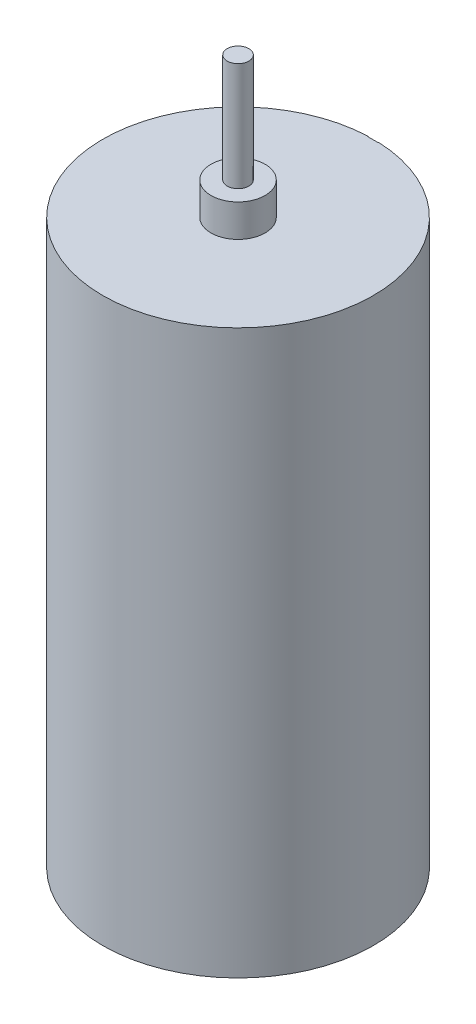
ISO-10303-21;
HEADER;
FILE_DESCRIPTION(('STEP AP214'),'2;1');
FILE_NAME('part.step','',(''),(''),'','','');
FILE_SCHEMA(('AUTOMOTIVE_DESIGN { 1 0 10303 214 1 1 1 1 }'));
ENDSEC;
DATA;
#1=APPLICATION_CONTEXT('core data for automotive mechanical design processes');
#2=APPLICATION_PROTOCOL_DEFINITION('international standard','automotive_design',2000,#1);
#3=PRODUCT_CONTEXT('',#1,'mechanical');
#4=PRODUCT('Part','Part','',(#3));
#5=PRODUCT_RELATED_PRODUCT_CATEGORY('part','',(#4));
#6=PRODUCT_DEFINITION_FORMATION('','',#4);
#7=PRODUCT_DEFINITION_CONTEXT('part definition',#1,'design');
#8=PRODUCT_DEFINITION('design','',#6,#7);
#9=PRODUCT_DEFINITION_SHAPE('','',#8);
#10=(LENGTH_UNIT() NAMED_UNIT(*) SI_UNIT(.MILLI.,.METRE.));
#11=(NAMED_UNIT(*) PLANE_ANGLE_UNIT() SI_UNIT($,.RADIAN.));
#12=(NAMED_UNIT(*) SI_UNIT($,.STERADIAN.) SOLID_ANGLE_UNIT());
#13=UNCERTAINTY_MEASURE_WITH_UNIT(LENGTH_MEASURE(1.E-05),#10,'distance_accuracy_value','');
#14=(GEOMETRIC_REPRESENTATION_CONTEXT(3) GLOBAL_UNCERTAINTY_ASSIGNED_CONTEXT((#13)) GLOBAL_UNIT_ASSIGNED_CONTEXT((#10,
#11,#12)) REPRESENTATION_CONTEXT('',''));
#15=CARTESIAN_POINT('',(0.,0.,0.));
#16=DIRECTION('',(0.,0.,1.));
#17=DIRECTION('',(1.,0.,0.));
#18=AXIS2_PLACEMENT_3D('',#15,#16,#17);
#19=CARTESIAN_POINT('',(0.,52.,0.));
#20=DIRECTION('',(0.,-1.,0.));
#21=DIRECTION('',(0.,0.,-1.));
#22=AXIS2_PLACEMENT_3D('',#19,#20,#21);
#23=CYLINDRICAL_SURFACE('',#22,12.5);
#24=CARTESIAN_POINT('',(0.,7.,0.));
#25=DIRECTION('',(0.,1.,0.));
#26=DIRECTION('',(0.,0.,1.));
#27=AXIS2_PLACEMENT_3D('',#24,#25,#26);
#28=CIRCLE('',#27,12.5);
#29=CARTESIAN_POINT('',(0.499999999999999,7.,-12.4899959967968));
#30=VERTEX_POINT('',#29);
#31=CARTESIAN_POINT('',(-0.500000000000001,7.,-12.4899959967968));
#32=VERTEX_POINT('',#31);
#33=EDGE_CURVE('E11',#30,#32,#28,.T.);
#34=ORIENTED_EDGE('',*,*,#33,.F.);
#35=DIRECTION('',(0.,-1.,0.));
#36=VECTOR('',#35,1.);
#37=CARTESIAN_POINT('',(0.499999999999999,52.,-12.4899959967968));
#38=LINE('',#37,#36);
#39=CARTESIAN_POINT('',(0.499999999999999,52.,-12.4899959967968));
#40=VERTEX_POINT('',#39);
#41=EDGE_CURVE('E46',#30,#40,#38,.F.);
#42=ORIENTED_EDGE('',*,*,#41,.T.);
#43=CARTESIAN_POINT('',(0.,52.,0.));
#44=DIRECTION('',(0.,1.,0.));
#45=DIRECTION('',(0.,0.,1.));
#46=AXIS2_PLACEMENT_3D('',#43,#44,#45);
#47=CIRCLE('',#46,12.5);
#48=CARTESIAN_POINT('',(-0.500000000000001,52.,-12.4899959967968));
#49=VERTEX_POINT('',#48);
#50=EDGE_CURVE('E113',#49,#40,#47,.T.);
#51=ORIENTED_EDGE('',*,*,#50,.F.);
#52=DIRECTION('',(0.,-1.,0.));
#53=VECTOR('',#52,1.);
#54=CARTESIAN_POINT('',(-0.5,52.,-12.4899959967968));
#55=LINE('',#54,#53);
#56=EDGE_CURVE('E95',#49,#32,#55,.T.);
#57=ORIENTED_EDGE('',*,*,#56,.T.);
#58=EDGE_LOOP('',(#34,#42,#51,#57));
#59=FACE_BOUND('',#58,.T.);
#60=CARTESIAN_POINT('',(0.,0.,0.));
#61=DIRECTION('',(0.,1.,0.));
#62=DIRECTION('',(0.,0.,1.));
#63=AXIS2_PLACEMENT_3D('',#60,#61,#62);
#64=CIRCLE('',#63,12.5);
#65=CARTESIAN_POINT('',(0.,0.,12.5));
#66=VERTEX_POINT('',#65);
#67=EDGE_CURVE('E110',#66,#66,#64,.T.);
#68=ORIENTED_EDGE('',*,*,#67,.T.);
#69=EDGE_LOOP('',(#68));
#70=FACE_BOUND('',#69,.T.);
#71=ADVANCED_FACE('F32',(#59,#70),#23,.T.);
#72=CARTESIAN_POINT('',(0.,52.,0.));
#73=DIRECTION('',(0.,1.,0.));
#74=DIRECTION('',(0.,0.,1.));
#75=AXIS2_PLACEMENT_3D('',#72,#73,#74);
#76=PLANE('',#75);
#77=DIRECTION('',(0.,0.,-1.));
#78=VECTOR('',#77,1.);
#79=CARTESIAN_POINT('',(0.499999999999999,52.,-12.55));
#80=LINE('',#79,#78);
#81=CARTESIAN_POINT('',(0.499999999999999,52.,-12.45));
#82=VERTEX_POINT('',#81);
#83=EDGE_CURVE('E92',#82,#40,#80,.T.);
#84=ORIENTED_EDGE('',*,*,#83,.F.);
#85=DIRECTION('',(1.,0.,0.));
#86=VECTOR('',#85,1.);
#87=CARTESIAN_POINT('',(-0.05,52.,-12.45));
#88=LINE('',#87,#86);
#89=CARTESIAN_POINT('',(-0.500000000000001,52.,-12.45));
#90=VERTEX_POINT('',#89);
#91=EDGE_CURVE('E99',#90,#82,#88,.T.);
#92=ORIENTED_EDGE('',*,*,#91,.F.);
#93=DIRECTION('',(0.,0.,1.));
#94=VECTOR('',#93,1.);
#95=CARTESIAN_POINT('',(-0.500000000000001,52.,-12.55));
#96=LINE('',#95,#94);
#97=EDGE_CURVE('E83',#49,#90,#96,.T.);
#98=ORIENTED_EDGE('',*,*,#97,.F.);
#99=ORIENTED_EDGE('',*,*,#50,.T.);
#100=EDGE_LOOP('',(#84,#92,#98,#99));
#101=FACE_BOUND('',#100,.T.);
#102=CARTESIAN_POINT('',(0.,52.,0.));
#103=DIRECTION('',(0.,1.,0.));
#104=DIRECTION('',(0.,0.,1.));
#105=AXIS2_PLACEMENT_3D('',#102,#103,#104);
#106=CIRCLE('',#105,2.5);
#107=CARTESIAN_POINT('',(0.,52.,2.5));
#108=VERTEX_POINT('',#107);
#109=EDGE_CURVE('E107',#108,#108,#106,.T.);
#110=ORIENTED_EDGE('',*,*,#109,.F.);
#111=EDGE_LOOP('',(#110));
#112=FACE_BOUND('',#111,.T.);
#113=ADVANCED_FACE('F122',(#101,#112),#76,.T.);
#114=CARTESIAN_POINT('',(0.,0.,0.));
#115=DIRECTION('',(0.,1.,0.));
#116=DIRECTION('',(0.,0.,1.));
#117=AXIS2_PLACEMENT_3D('',#114,#115,#116);
#118=PLANE('',#117);
#119=ORIENTED_EDGE('',*,*,#67,.F.);
#120=EDGE_LOOP('',(#119));
#121=FACE_BOUND('',#120,.T.);
#122=ADVANCED_FACE('F119',(#121),#118,.F.);
#123=CARTESIAN_POINT('',(0.,55.,0.));
#124=DIRECTION('',(0.,-1.,0.));
#125=DIRECTION('',(0.,0.,-1.));
#126=AXIS2_PLACEMENT_3D('',#123,#124,#125);
#127=CYLINDRICAL_SURFACE('',#126,2.5);
#128=CARTESIAN_POINT('',(0.,55.,0.));
#129=DIRECTION('',(0.,1.,0.));
#130=DIRECTION('',(0.,0.,1.));
#131=AXIS2_PLACEMENT_3D('',#128,#129,#130);
#132=CIRCLE('',#131,2.5);
#133=CARTESIAN_POINT('',(0.,55.,2.5));
#134=VERTEX_POINT('',#133);
#135=EDGE_CURVE('E104',#134,#134,#132,.T.);
#136=ORIENTED_EDGE('',*,*,#135,.F.);
#137=EDGE_LOOP('',(#136));
#138=FACE_BOUND('',#137,.T.);
#139=ORIENTED_EDGE('',*,*,#109,.T.);
#140=EDGE_LOOP('',(#139));
#141=FACE_BOUND('',#140,.T.);
#142=ADVANCED_FACE('F121',(#138,#141),#127,.T.);
#143=CARTESIAN_POINT('',(0.,55.,0.));
#144=DIRECTION('',(0.,1.,0.));
#145=DIRECTION('',(0.,0.,1.));
#146=AXIS2_PLACEMENT_3D('',#143,#144,#145);
#147=PLANE('',#146);
#148=CARTESIAN_POINT('',(0.,55.,0.));
#149=DIRECTION('',(0.,1.,0.));
#150=DIRECTION('',(0.,0.,1.));
#151=AXIS2_PLACEMENT_3D('',#148,#149,#150);
#152=CIRCLE('',#151,1.);
#153=CARTESIAN_POINT('',(0.,55.,1.));
#154=VERTEX_POINT('',#153);
#155=EDGE_CURVE('E39',#154,#154,#152,.T.);
#156=ORIENTED_EDGE('',*,*,#155,.F.);
#157=EDGE_LOOP('',(#156));
#158=FACE_BOUND('',#157,.T.);
#159=ORIENTED_EDGE('',*,*,#135,.T.);
#160=EDGE_LOOP('',(#159));
#161=FACE_BOUND('',#160,.T.);
#162=ADVANCED_FACE('F127',(#158,#161),#147,.T.);
#163=CARTESIAN_POINT('',(0.,65.,0.));
#164=DIRECTION('',(0.,-1.,0.));
#165=DIRECTION('',(0.,0.,-1.));
#166=AXIS2_PLACEMENT_3D('',#163,#164,#165);
#167=CYLINDRICAL_SURFACE('',#166,1.);
#168=CARTESIAN_POINT('',(0.,65.,0.));
#169=DIRECTION('',(0.,1.,0.));
#170=DIRECTION('',(0.,0.,1.));
#171=AXIS2_PLACEMENT_3D('',#168,#169,#170);
#172=CIRCLE('',#171,1.);
#173=CARTESIAN_POINT('',(0.,65.,1.));
#174=VERTEX_POINT('',#173);
#175=EDGE_CURVE('E101',#174,#174,#172,.T.);
#176=ORIENTED_EDGE('',*,*,#175,.F.);
#177=EDGE_LOOP('',(#176));
#178=FACE_BOUND('',#177,.T.);
#179=ORIENTED_EDGE('',*,*,#155,.T.);
#180=EDGE_LOOP('',(#179));
#181=FACE_BOUND('',#180,.T.);
#182=ADVANCED_FACE('F154',(#178,#181),#167,.T.);
#183=CARTESIAN_POINT('',(0.,65.,0.));
#184=DIRECTION('',(0.,1.,0.));
#185=DIRECTION('',(0.,0.,1.));
#186=AXIS2_PLACEMENT_3D('',#183,#184,#185);
#187=PLANE('',#186);
#188=ORIENTED_EDGE('',*,*,#175,.T.);
#189=EDGE_LOOP('',(#188));
#190=FACE_BOUND('',#189,.T.);
#191=ADVANCED_FACE('F151',(#190),#187,.T.);
#192=CARTESIAN_POINT('',(-0.05,51.9,-12.45));
#193=DIRECTION('',(0.,0.,1.));
#194=DIRECTION('',(1.,0.,0.));
#195=AXIS2_PLACEMENT_3D('',#192,#193,#194);
#196=PLANE('',#195);
#197=ORIENTED_EDGE('',*,*,#91,.T.);
#198=DIRECTION('',(0.,1.,0.));
#199=VECTOR('',#198,1.);
#200=CARTESIAN_POINT('',(0.499999999999999,7.,-12.45));
#201=LINE('',#200,#199);
#202=CARTESIAN_POINT('',(0.499999999999999,7.,-12.45));
#203=VERTEX_POINT('',#202);
#204=EDGE_CURVE('E85',#203,#82,#201,.T.);
#205=ORIENTED_EDGE('',*,*,#204,.F.);
#206=DIRECTION('',(1.,0.,0.));
#207=VECTOR('',#206,1.);
#208=CARTESIAN_POINT('',(-0.500000000000001,7.,-12.45));
#209=LINE('',#208,#207);
#210=CARTESIAN_POINT('',(-0.500000000000001,7.,-12.45));
#211=VERTEX_POINT('',#210);
#212=EDGE_CURVE('E73',#211,#203,#209,.T.);
#213=ORIENTED_EDGE('',*,*,#212,.F.);
#214=DIRECTION('',(0.,1.,0.));
#215=VECTOR('',#214,1.);
#216=CARTESIAN_POINT('',(-0.500000000000001,7.,-12.45));
#217=LINE('',#216,#215);
#218=EDGE_CURVE('E80',#211,#90,#217,.T.);
#219=ORIENTED_EDGE('',*,*,#218,.T.);
#220=EDGE_LOOP('',(#197,#205,#213,#219));
#221=FACE_BOUND('',#220,.T.);
#222=ADVANCED_FACE('F87',(#221),#196,.F.);
#223=CARTESIAN_POINT('',(0.,7.,0.));
#224=DIRECTION('',(0.,1.,0.));
#225=DIRECTION('',(0.,0.,1.));
#226=AXIS2_PLACEMENT_3D('',#223,#224,#225);
#227=PLANE('',#226);
#228=ORIENTED_EDGE('',*,*,#33,.T.);
#229=DIRECTION('',(0.,0.,1.));
#230=VECTOR('',#229,1.);
#231=CARTESIAN_POINT('',(-0.500000000000001,7.,-12.55));
#232=LINE('',#231,#230);
#233=EDGE_CURVE('E69',#32,#211,#232,.T.);
#234=ORIENTED_EDGE('',*,*,#233,.T.);
#235=ORIENTED_EDGE('',*,*,#212,.T.);
#236=DIRECTION('',(0.,0.,-1.));
#237=VECTOR('',#236,1.);
#238=CARTESIAN_POINT('',(0.499999999999999,7.,-12.55));
#239=LINE('',#238,#237);
#240=EDGE_CURVE('E76',#203,#30,#239,.T.);
#241=ORIENTED_EDGE('',*,*,#240,.T.);
#242=EDGE_LOOP('',(#228,#234,#235,#241));
#243=FACE_BOUND('',#242,.T.);
#244=ADVANCED_FACE('F71',(#243),#227,.T.);
#245=CARTESIAN_POINT('',(0.499999999999999,7.,-12.55));
#246=DIRECTION('',(1.,0.,0.));
#247=DIRECTION('',(0.,0.,-1.));
#248=AXIS2_PLACEMENT_3D('',#245,#246,#247);
#249=PLANE('',#248);
#250=ORIENTED_EDGE('',*,*,#240,.F.);
#251=ORIENTED_EDGE('',*,*,#204,.T.);
#252=ORIENTED_EDGE('',*,*,#83,.T.);
#253=ORIENTED_EDGE('',*,*,#41,.F.);
#254=EDGE_LOOP('',(#250,#251,#252,#253));
#255=FACE_BOUND('',#254,.T.);
#256=ADVANCED_FACE('F139',(#255),#249,.F.);
#257=CARTESIAN_POINT('',(-0.500000000000001,7.,-12.55));
#258=DIRECTION('',(-1.,0.,0.));
#259=DIRECTION('',(0.,0.,1.));
#260=AXIS2_PLACEMENT_3D('',#257,#258,#259);
#261=PLANE('',#260);
#262=ORIENTED_EDGE('',*,*,#97,.T.);
#263=ORIENTED_EDGE('',*,*,#218,.F.);
#264=ORIENTED_EDGE('',*,*,#233,.F.);
#265=ORIENTED_EDGE('',*,*,#56,.F.);
#266=EDGE_LOOP('',(#262,#263,#264,#265));
#267=FACE_BOUND('',#266,.T.);
#268=ADVANCED_FACE('F81',(#267),#261,.F.);
#269=CLOSED_SHELL('',(#71,#113,#122,#142,#162,#182,#191,#222,#244,#256,#268));
#270=MANIFOLD_SOLID_BREP('B2',#269);
#271=ADVANCED_BREP_SHAPE_REPRESENTATION('',(#18,#270),#14);
#272=SHAPE_DEFINITION_REPRESENTATION(#9,#271);
ENDSEC;
END-ISO-10303-21;
